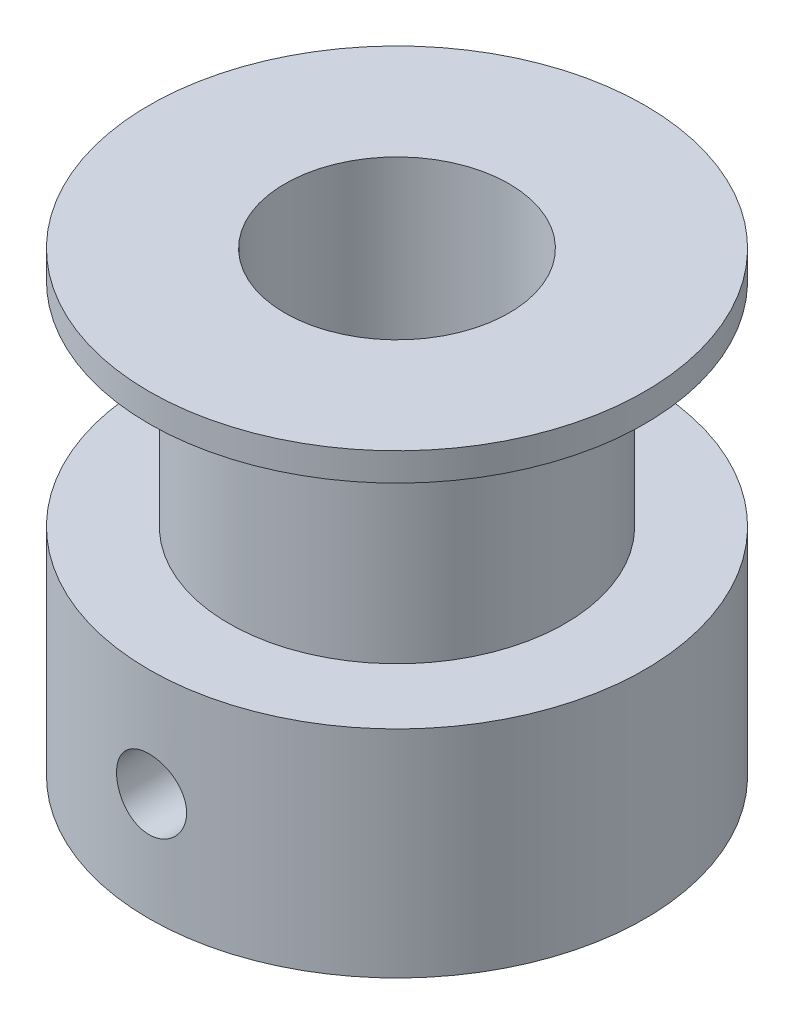
ISO-10303-21;
HEADER;
FILE_DESCRIPTION(('STEP AP214'),'2;1');
FILE_NAME('part.step','',(''),(''),'','','');
FILE_SCHEMA(('AUTOMOTIVE_DESIGN { 1 0 10303 214 1 1 1 1 }'));
ENDSEC;
DATA;
#1=APPLICATION_CONTEXT('core data for automotive mechanical design processes');
#2=APPLICATION_PROTOCOL_DEFINITION('international standard','automotive_design',2000,#1);
#3=PRODUCT_CONTEXT('',#1,'mechanical');
#4=PRODUCT('Part','Part','',(#3));
#5=PRODUCT_RELATED_PRODUCT_CATEGORY('part','',(#4));
#6=PRODUCT_DEFINITION_FORMATION('','',#4);
#7=PRODUCT_DEFINITION_CONTEXT('part definition',#1,'design');
#8=PRODUCT_DEFINITION('design','',#6,#7);
#9=PRODUCT_DEFINITION_SHAPE('','',#8);
#10=(LENGTH_UNIT() NAMED_UNIT(*) SI_UNIT(.MILLI.,.METRE.));
#11=(NAMED_UNIT(*) PLANE_ANGLE_UNIT() SI_UNIT($,.RADIAN.));
#12=(NAMED_UNIT(*) SI_UNIT($,.STERADIAN.) SOLID_ANGLE_UNIT());
#13=UNCERTAINTY_MEASURE_WITH_UNIT(LENGTH_MEASURE(1.E-05),#10,'distance_accuracy_value','');
#14=(GEOMETRIC_REPRESENTATION_CONTEXT(3) GLOBAL_UNCERTAINTY_ASSIGNED_CONTEXT((#13)) GLOBAL_UNIT_ASSIGNED_CONTEXT((#10,
#11,#12)) REPRESENTATION_CONTEXT('',''));
#15=CARTESIAN_POINT('',(0.,0.,0.));
#16=DIRECTION('',(0.,0.,1.));
#17=DIRECTION('',(1.,0.,0.));
#18=AXIS2_PLACEMENT_3D('',#15,#16,#17);
#19=CARTESIAN_POINT('',(0.,7.7,0.));
#20=DIRECTION('',(0.,1.,0.));
#21=DIRECTION('',(0.,0.,1.));
#22=AXIS2_PLACEMENT_3D('',#19,#20,#21);
#23=PLANE('',#22);
#24=CARTESIAN_POINT('',(0.,7.7,0.));
#25=DIRECTION('',(0.,1.,0.));
#26=DIRECTION('',(0.,0.,1.));
#27=AXIS2_PLACEMENT_3D('',#24,#25,#26);
#28=CIRCLE('',#27,8.85);
#29=CARTESIAN_POINT('',(0.,7.7,8.85));
#30=VERTEX_POINT('',#29);
#31=EDGE_CURVE('E12',#30,#30,#28,.T.);
#32=ORIENTED_EDGE('',*,*,#31,.T.);
#33=EDGE_LOOP('',(#32));
#34=FACE_BOUND('',#33,.T.);
#35=CARTESIAN_POINT('',(0.,7.7,0.));
#36=DIRECTION('',(0.,1.,0.));
#37=DIRECTION('',(0.,0.,1.));
#38=AXIS2_PLACEMENT_3D('',#35,#36,#37);
#39=CIRCLE('',#38,6.);
#40=CARTESIAN_POINT('',(0.,7.7,-6.));
#41=VERTEX_POINT('',#40);
#42=EDGE_CURVE('E59',#41,#41,#39,.T.);
#43=ORIENTED_EDGE('',*,*,#42,.F.);
#44=EDGE_LOOP('',(#43));
#45=FACE_BOUND('',#44,.T.);
#46=ADVANCED_FACE('F46',(#34,#45),#23,.T.);
#47=CARTESIAN_POINT('',(0.,7.7,0.));
#48=DIRECTION('',(0.,-1.,0.));
#49=DIRECTION('',(0.,0.,-1.));
#50=AXIS2_PLACEMENT_3D('',#47,#48,#49);
#51=CYLINDRICAL_SURFACE('',#50,8.85);
#52=CARTESIAN_POINT('',(-8.76127844552381,3.85,-1.25000000000002));
#53=CARTESIAN_POINT('',(-8.76127955833945,3.91983629256289,-1.24999708201939));
#54=CARTESIAN_POINT('',(-8.76212247343734,3.98971427935337,-1.24412769535317));
#55=CARTESIAN_POINT('',(-8.76540114993128,4.12751988072338,-1.22080955947898));
#56=CARTESIAN_POINT('',(-8.76783850599689,4.19544547155025,-1.20334921739481));
#57=CARTESIAN_POINT('',(-8.77402461798429,4.32733144869984,-1.15737909064777));
#58=CARTESIAN_POINT('',(-8.77777241048102,4.39129470754815,-1.12887742184564));
#59=CARTESIAN_POINT('',(-8.78615596433031,4.51352061150257,-1.06165220515114));
#60=CARTESIAN_POINT('',(-8.79079159250454,4.57178410961404,-1.02293019001592));
#61=CARTESIAN_POINT('',(-8.80046537837758,4.68138104602949,-0.936069093169977));
#62=CARTESIAN_POINT('',(-8.80550590770879,4.73266807354044,-0.8878717097803));
#63=CARTESIAN_POINT('',(-8.81540033266231,4.82645449615084,-0.783553810814694));
#64=CARTESIAN_POINT('',(-8.82025421838233,4.86895342552507,-0.727432875595245));
#65=CARTESIAN_POINT('',(-8.82925309298364,4.94412688567266,-0.608565508816701));
#66=CARTESIAN_POINT('',(-8.8333949838143,4.97675892816766,-0.545791952535329));
#67=CARTESIAN_POINT('',(-8.84047699071294,5.0309998483366,-0.415586968350984));
#68=CARTESIAN_POINT('',(-8.84341716324546,5.05260924393786,-0.34815575946884));
#69=CARTESIAN_POINT('',(-8.84774773304751,5.08405145650724,-0.211026547555804));
#70=CARTESIAN_POINT('',(-8.84914833092397,5.09396181936996,-0.141346652267816));
#71=CARTESIAN_POINT('',(-8.85027685753542,5.10196526324904,-0.00129975776516401));
#72=CARTESIAN_POINT('',(-8.85000486919982,5.10005893015542,0.0690672072108078));
#73=CARTESIAN_POINT('',(-8.84782705700059,5.08454464300186,0.207962261898438));
#74=CARTESIAN_POINT('',(-8.84593288036171,5.07102010490143,0.276499877460448));
#75=CARTESIAN_POINT('',(-8.84073651907011,5.03278405602722,0.410322920588073));
#76=CARTESIAN_POINT('',(-8.83743430158142,5.00807228436269,0.475608272270179));
#77=CARTESIAN_POINT('',(-8.82977283290082,4.94807662795789,0.601328189328235));
#78=CARTESIAN_POINT('',(-8.82541004388626,4.91275726389124,0.661745599009044));
#79=CARTESIAN_POINT('',(-8.81611436769792,4.83257487594348,0.775827507942207));
#80=CARTESIAN_POINT('',(-8.81118144720716,4.78771129419446,0.829491612165969));
#81=CARTESIAN_POINT('',(-8.80124557150607,4.68924834824854,0.92903470068311));
#82=CARTESIAN_POINT('',(-8.79624238072274,4.6355762003181,0.97484169729169));
#83=CARTESIAN_POINT('',(-8.78677200649964,4.5212679702468,1.05680912474714));
#84=CARTESIAN_POINT('',(-8.78230482569179,4.46063185391421,1.09296950822812));
#85=CARTESIAN_POINT('',(-8.77441239227346,4.33404593724077,1.15462488023047));
#86=CARTESIAN_POINT('',(-8.77098780359819,4.26809278461357,1.18011307643547));
#87=CARTESIAN_POINT('',(-8.76558046892521,4.13278293054173,1.21963133328681));
#88=CARTESIAN_POINT('',(-8.7635976333465,4.06342644084381,1.23366210582825));
#89=CARTESIAN_POINT('',(-8.76131509462908,3.92391743164996,1.24976976627735));
#90=CARTESIAN_POINT('',(-8.7610010621843,3.85377688884366,1.2519484271046));
#91=CARTESIAN_POINT('',(-8.76205369837487,3.71413173947837,1.24455950789984));
#92=CARTESIAN_POINT('',(-8.76342032095584,3.64462711554609,1.23499224973701));
#93=CARTESIAN_POINT('',(-8.76766715414962,3.50853824980679,1.20446916051189));
#94=CARTESIAN_POINT('',(-8.77054069443162,3.44194252801921,1.183563504715));
#95=CARTESIAN_POINT('',(-8.77747212514519,3.31320091658317,1.13100904540532));
#96=CARTESIAN_POINT('',(-8.78153006790803,3.25105522370454,1.09935976718954));
#97=CARTESIAN_POINT('',(-8.79040704938085,3.13251996690258,1.02596983980517));
#98=CARTESIAN_POINT('',(-8.79523100587522,3.07617176438167,0.98416299094421));
#99=CARTESIAN_POINT('',(-8.80508144112995,2.97125502092087,0.891737264962247));
#100=CARTESIAN_POINT('',(-8.81010792999751,2.92268686884142,0.841117947642463));
#101=CARTESIAN_POINT('',(-8.8198415792009,2.83434635877496,0.732057305954626));
#102=CARTESIAN_POINT('',(-8.82454612241681,2.79464123765306,0.673561251208003));
#103=CARTESIAN_POINT('',(-8.83306572575993,2.72562112238945,0.550670679829675));
#104=CARTESIAN_POINT('',(-8.83688080792471,2.6963058708156,0.486276309391627));
#105=CARTESIAN_POINT('',(-8.84318011476376,2.64900641894674,0.353631926318678));
#106=CARTESIAN_POINT('',(-8.84566874384817,2.63098468371386,0.285395516143358));
#107=CARTESIAN_POINT('',(-8.84905316166264,2.60666210993928,0.146827443991046));
#108=CARTESIAN_POINT('',(-8.84994904317226,2.60036058867938,0.076495904300664));
#109=CARTESIAN_POINT('',(-8.85004627804799,2.59967253564334,-0.0636122523454483));
#110=CARTESIAN_POINT('',(-8.84926230377789,2.60518283604321,-0.133388374619712));
#111=CARTESIAN_POINT('',(-8.84611733649831,2.62774184826329,-0.271011658388236));
#112=CARTESIAN_POINT('',(-8.84375634693595,2.64479053486225,-0.338858824098578));
#113=CARTESIAN_POINT('',(-8.83772137393164,2.6899072861997,-0.470675365074374));
#114=CARTESIAN_POINT('',(-8.83404814590582,2.71796901197764,-0.534646946667156));
#115=CARTESIAN_POINT('',(-8.82579336006288,2.78430443228636,-0.656989737158081));
#116=CARTESIAN_POINT('',(-8.8212117795589,2.82257838188407,-0.715360806124776));
#117=CARTESIAN_POINT('',(-8.81160272990891,2.90862818864169,-0.825370438534391));
#118=CARTESIAN_POINT('',(-8.80657186722225,2.95648047372549,-0.876948928289745));
#119=CARTESIAN_POINT('',(-8.79665715494533,3.06016810612595,-0.971382209874208));
#120=CARTESIAN_POINT('',(-8.79177334022663,3.11600532925321,-1.01423494611155));
#121=CARTESIAN_POINT('',(-8.78267983978148,3.23440042453076,-1.09018789773071));
#122=CARTESIAN_POINT('',(-8.77847360982668,3.29699018863463,-1.12323879986212));
#123=CARTESIAN_POINT('',(-8.77125197907736,3.42686011114792,-1.17831106476572));
#124=CARTESIAN_POINT('',(-8.76823532108644,3.49413522886783,-1.20034407840902));
#125=CARTESIAN_POINT('',(-8.76444461826387,3.60977522915171,-1.22765227176474));
#126=CARTESIAN_POINT('',(-8.76326345506154,3.65741987506185,-1.2360201377838));
#127=CARTESIAN_POINT('',(-8.76167998787418,3.7533696972197,-1.24719498147199));
#128=CARTESIAN_POINT('',(-8.76127767548057,3.80167486633063,-1.25000201917657));
#129=CARTESIAN_POINT('',(-8.76127844552381,3.85,-1.25000000000002));
#130=B_SPLINE_CURVE_WITH_KNOTS('',3,(#52,#53,#54,#55,#56,#57,#58,#59,#60,#61,#62,#63,#64,#65,
#66,#67,#68,#69,#70,#71,#72,#73,#74,#75,#76,#77,#78,#79,#80,#81,#82,#83,#84,#85,#86,#87,#88,#89,
#90,#91,#92,#93,#94,#95,#96,#97,#98,#99,#100,#101,#102,#103,#104,#105,#106,#107,#108,#109,#110,
#111,#112,#113,#114,#115,#116,#117,#118,#119,#120,#121,#122,#123,#124,#125,#126,#127,#128,#129),
.UNSPECIFIED.,.T.,.F.,(4,2,2,2,2,2,2,2,2,2,2,2,2,2,2,2,2,2,2,2,2,2,2,2,2,2,2,2,2,2,2,2,2,2,2,2,
2,2,4),(0.,0.209332280228205,0.41887424350023,0.628262475567086,0.837619323263729,
1.04830710403637,1.25900604734729,1.47059977743544,1.6821835643335,1.89235687022572,
2.1025197554847,2.3111862133078,2.51985753756676,2.72923473046087,2.93862416500036,
3.14983997735836,3.36105682678938,3.57240790165164,3.78374584343501,3.99326614850467,
4.20278071229308,4.41137559755892,4.61997970071267,4.82998162923051,5.03999405073688,
5.25154926862722,5.46309924439968,5.67394233441947,5.88477314216119,6.09377000087417,
6.30276640275181,6.51164268506203,6.72052418488635,6.93114408462367,7.14181354442582,
7.35352557529174,7.5650132552425,7.7098680186856,7.85472121824844),.UNSPECIFIED.);
#131=CARTESIAN_POINT('',(-8.76127844552381,3.85,-1.25000000000002));
#132=VERTEX_POINT('',#131);
#133=EDGE_CURVE('E103',#132,#132,#130,.T.);
#134=ORIENTED_EDGE('',*,*,#133,.T.);
#135=EDGE_LOOP('',(#134));
#136=FACE_BOUND('',#135,.T.);
#137=CARTESIAN_POINT('',(-1.24999999999999,3.85,8.76127844552381));
#138=CARTESIAN_POINT('',(-1.24999708201936,3.91983629256289,8.76127955833946));
#139=CARTESIAN_POINT('',(-1.24412769535314,3.98971427935337,8.76212247343735));
#140=CARTESIAN_POINT('',(-1.22080955947895,4.12751988072338,8.76540114993128));
#141=CARTESIAN_POINT('',(-1.20334921739478,4.19544547155025,8.7678385059969));
#142=CARTESIAN_POINT('',(-1.15737909064773,4.32733144869984,8.7740246179843));
#143=CARTESIAN_POINT('',(-1.12887742184561,4.39129470754815,8.77777241048102));
#144=CARTESIAN_POINT('',(-1.06165220515111,4.51352061150257,8.78615596433031));
#145=CARTESIAN_POINT('',(-1.02293019001589,4.57178410961404,8.79079159250454));
#146=CARTESIAN_POINT('',(-0.936069093169947,4.68138104602949,8.80046537837758));
#147=CARTESIAN_POINT('',(-0.887871709780269,4.73266807354044,8.8055059077088));
#148=CARTESIAN_POINT('',(-0.783553810814663,4.82645449615084,8.81540033266231));
#149=CARTESIAN_POINT('',(-0.727432875595214,4.86895342552507,8.82025421838234));
#150=CARTESIAN_POINT('',(-0.60856550881667,4.94412688567266,8.82925309298364));
#151=CARTESIAN_POINT('',(-0.545791952535298,4.97675892816766,8.8333949838143));
#152=CARTESIAN_POINT('',(-0.415586968350953,5.0309998483366,8.84047699071294));
#153=CARTESIAN_POINT('',(-0.348155759468809,5.05260924393786,8.84341716324546));
#154=CARTESIAN_POINT('',(-0.211026547555773,5.08405145650724,8.84774773304751));
#155=CARTESIAN_POINT('',(-0.141346652267786,5.09396181936996,8.84914833092397));
#156=CARTESIAN_POINT('',(-0.00129975776513321,5.10196526324904,8.85027685753542));
#157=CARTESIAN_POINT('',(0.0690672072108386,5.10005893015542,8.85000486919982));
#158=CARTESIAN_POINT('',(0.207962261898469,5.08454464300186,8.84782705700059));
#159=CARTESIAN_POINT('',(0.276499877460479,5.07102010490143,8.84593288036171));
#160=CARTESIAN_POINT('',(0.410322920588104,5.03278405602722,8.84073651907011));
#161=CARTESIAN_POINT('',(0.47560827227021,5.00807228436269,8.83743430158142));
#162=CARTESIAN_POINT('',(0.601328189328266,4.94807662795789,8.82977283290082));
#163=CARTESIAN_POINT('',(0.661745599009075,4.91275726389124,8.82541004388626));
#164=CARTESIAN_POINT('',(0.775827507942237,4.83257487594348,8.81611436769792));
#165=CARTESIAN_POINT('',(0.829491612166,4.78771129419446,8.81118144720716));
#166=CARTESIAN_POINT('',(0.929034700683141,4.68924834824854,8.80124557150607));
#167=CARTESIAN_POINT('',(0.974841697291721,4.6355762003181,8.79624238072274));
#168=CARTESIAN_POINT('',(1.05680912474717,4.5212679702468,8.78677200649963));
#169=CARTESIAN_POINT('',(1.09296950822815,4.46063185391421,8.78230482569179));
#170=CARTESIAN_POINT('',(1.1546248802305,4.33404593724077,8.77441239227345));
#171=CARTESIAN_POINT('',(1.1801130764355,4.26809278461357,8.77098780359818));
#172=CARTESIAN_POINT('',(1.21963133328684,4.13278293054173,8.7655804689252));
#173=CARTESIAN_POINT('',(1.23366210582828,4.06342644084381,8.7635976333465));
#174=CARTESIAN_POINT('',(1.24976976627738,3.92391743164996,8.76131509462908));
#175=CARTESIAN_POINT('',(1.25194842710463,3.85377688884366,8.76100106218429));
#176=CARTESIAN_POINT('',(1.24455950789987,3.71413173947837,8.76205369837486));
#177=CARTESIAN_POINT('',(1.23499224973704,3.64462711554609,8.76342032095583));
#178=CARTESIAN_POINT('',(1.20446916051192,3.50853824980679,8.76766715414961));
#179=CARTESIAN_POINT('',(1.18356350471503,3.44194252801921,8.77054069443162));
#180=CARTESIAN_POINT('',(1.13100904540535,3.31320091658317,8.77747212514519));
#181=CARTESIAN_POINT('',(1.09935976718957,3.25105522370454,8.78153006790803));
#182=CARTESIAN_POINT('',(1.0259698398052,3.13251996690258,8.79040704938084));
#183=CARTESIAN_POINT('',(0.984162990944241,3.07617176438167,8.79523100587522));
#184=CARTESIAN_POINT('',(0.891737264962278,2.97125502092087,8.80508144112994));
#185=CARTESIAN_POINT('',(0.841117947642493,2.92268686884142,8.8101079299975));
#186=CARTESIAN_POINT('',(0.732057305954657,2.83434635877496,8.81984157920089));
#187=CARTESIAN_POINT('',(0.673561251208034,2.79464123765306,8.82454612241681));
#188=CARTESIAN_POINT('',(0.550670679829706,2.72562112238945,8.83306572575993));
#189=CARTESIAN_POINT('',(0.486276309391658,2.6963058708156,8.83688080792471));
#190=CARTESIAN_POINT('',(0.353631926318709,2.64900641894674,8.84318011476376));
#191=CARTESIAN_POINT('',(0.285395516143389,2.63098468371386,8.84566874384817));
#192=CARTESIAN_POINT('',(0.146827443991076,2.60666210993928,8.84905316166264));
#193=CARTESIAN_POINT('',(0.0764959043006948,2.60036058867938,8.84994904317226));
#194=CARTESIAN_POINT('',(-0.0636122523454176,2.59967253564334,8.85004627804799));
#195=CARTESIAN_POINT('',(-0.133388374619681,2.60518283604321,8.84926230377789));
#196=CARTESIAN_POINT('',(-0.271011658388205,2.62774184826329,8.84611733649831));
#197=CARTESIAN_POINT('',(-0.338858824098547,2.64479053486225,8.84375634693595));
#198=CARTESIAN_POINT('',(-0.470675365074343,2.6899072861997,8.83772137393164));
#199=CARTESIAN_POINT('',(-0.534646946667125,2.71796901197764,8.83404814590583));
#200=CARTESIAN_POINT('',(-0.65698973715805,2.78430443228636,8.82579336006288));
#201=CARTESIAN_POINT('',(-0.715360806124745,2.82257838188407,8.82121177955891));
#202=CARTESIAN_POINT('',(-0.825370438534361,2.90862818864169,8.81160272990891));
#203=CARTESIAN_POINT('',(-0.876948928289715,2.95648047372549,8.80657186722225));
#204=CARTESIAN_POINT('',(-0.971382209874177,3.06016810612595,8.79665715494533));
#205=CARTESIAN_POINT('',(-1.01423494611152,3.11600532925321,8.79177334022663));
#206=CARTESIAN_POINT('',(-1.09018789773068,3.23440042453076,8.78267983978149));
#207=CARTESIAN_POINT('',(-1.12323879986209,3.29699018863463,8.77847360982668));
#208=CARTESIAN_POINT('',(-1.17831106476569,3.42686011114792,8.77125197907737));
#209=CARTESIAN_POINT('',(-1.20034407840899,3.49413522886783,8.76823532108645));
#210=CARTESIAN_POINT('',(-1.2276522717647,3.60977522915171,8.76444461826387));
#211=CARTESIAN_POINT('',(-1.23602013778377,3.65741987506185,8.76326345506155));
#212=CARTESIAN_POINT('',(-1.24719498147196,3.7533696972197,8.76167998787419));
#213=CARTESIAN_POINT('',(-1.25000201917654,3.80167486633063,8.76127767548057));
#214=CARTESIAN_POINT('',(-1.24999999999999,3.85,8.76127844552381));
#215=B_SPLINE_CURVE_WITH_KNOTS('',3,(#137,#138,#139,#140,#141,#142,#143,#144,#145,#146,#147,
#148,#149,#150,#151,#152,#153,#154,#155,#156,#157,#158,#159,#160,#161,#162,#163,#164,#165,#166,
#167,#168,#169,#170,#171,#172,#173,#174,#175,#176,#177,#178,#179,#180,#181,#182,#183,#184,#185,
#186,#187,#188,#189,#190,#191,#192,#193,#194,#195,#196,#197,#198,#199,#200,#201,#202,#203,#204,
#205,#206,#207,#208,#209,#210,#211,#212,#213,#214),.UNSPECIFIED.,.T.,.F.,(4,2,2,2,2,2,2,2,2,2,2,
2,2,2,2,2,2,2,2,2,2,2,2,2,2,2,2,2,2,2,2,2,2,2,2,2,2,2,4),(0.,0.209332280228205,0.41887424350023,
0.628262475567086,0.837619323263729,1.04830710403637,1.25900604734729,1.47059977743544,
1.6821835643335,1.89235687022572,2.1025197554847,2.3111862133078,2.51985753756676,
2.72923473046087,2.93862416500036,3.14983997735836,3.36105682678938,3.57240790165164,
3.78374584343501,3.99326614850467,4.20278071229308,4.41137559755892,4.61997970071267,
4.82998162923051,5.03999405073688,5.25154926862723,5.46309924439968,5.67394233441947,
5.88477314216119,6.09377000087417,6.30276640275182,6.51164268506203,6.72052418488635,
6.93114408462367,7.14181354442582,7.35352557529174,7.5650132552425,7.7098680186856,
7.85472121824844),.UNSPECIFIED.);
#216=CARTESIAN_POINT('',(-1.24999999999999,3.85,8.76127844552381));
#217=VERTEX_POINT('',#216);
#218=EDGE_CURVE('E83',#217,#217,#215,.T.);
#219=ORIENTED_EDGE('',*,*,#218,.T.);
#220=EDGE_LOOP('',(#219));
#221=FACE_BOUND('',#220,.T.);
#222=ORIENTED_EDGE('',*,*,#31,.F.);
#223=EDGE_LOOP('',(#222));
#224=FACE_BOUND('',#223,.T.);
#225=CARTESIAN_POINT('',(0.,0.,0.));
#226=DIRECTION('',(0.,1.,0.));
#227=DIRECTION('',(0.,0.,1.));
#228=AXIS2_PLACEMENT_3D('',#225,#226,#227);
#229=CIRCLE('',#228,8.85);
#230=CARTESIAN_POINT('',(0.,0.,8.85));
#231=VERTEX_POINT('',#230);
#232=EDGE_CURVE('E50',#231,#231,#229,.T.);
#233=ORIENTED_EDGE('',*,*,#232,.T.);
#234=EDGE_LOOP('',(#233));
#235=FACE_BOUND('',#234,.T.);
#236=ADVANCED_FACE('F48',(#136,#221,#224,#235),#51,.T.);
#237=CARTESIAN_POINT('',(0.,0.,0.));
#238=DIRECTION('',(0.,1.,0.));
#239=DIRECTION('',(0.,0.,1.));
#240=AXIS2_PLACEMENT_3D('',#237,#238,#239);
#241=PLANE('',#240);
#242=CARTESIAN_POINT('',(0.,0.,0.));
#243=DIRECTION('',(0.,1.,0.));
#244=DIRECTION('',(0.,0.,1.));
#245=AXIS2_PLACEMENT_3D('',#242,#243,#244);
#246=CIRCLE('',#245,4.);
#247=CARTESIAN_POINT('',(0.,0.,4.));
#248=VERTEX_POINT('',#247);
#249=EDGE_CURVE('E68',#248,#248,#246,.T.);
#250=ORIENTED_EDGE('',*,*,#249,.T.);
#251=EDGE_LOOP('',(#250));
#252=FACE_BOUND('',#251,.T.);
#253=ORIENTED_EDGE('',*,*,#232,.F.);
#254=EDGE_LOOP('',(#253));
#255=FACE_BOUND('',#254,.T.);
#256=ADVANCED_FACE('F146',(#252,#255),#241,.F.);
#257=CARTESIAN_POINT('',(0.,15.3,0.));
#258=DIRECTION('',(0.,-1.,0.));
#259=DIRECTION('',(0.,0.,-1.));
#260=AXIS2_PLACEMENT_3D('',#257,#258,#259);
#261=CYLINDRICAL_SURFACE('',#260,6.);
#262=CARTESIAN_POINT('',(0.,15.3,0.));
#263=DIRECTION('',(0.,1.,0.));
#264=DIRECTION('',(0.,0.,1.));
#265=AXIS2_PLACEMENT_3D('',#262,#263,#264);
#266=CIRCLE('',#265,6.);
#267=CARTESIAN_POINT('',(0.,15.3,-6.));
#268=VERTEX_POINT('',#267);
#269=EDGE_CURVE('E57',#268,#268,#266,.T.);
#270=CARTESIAN_POINT('',(0.,15.3,-6.));
#271=CARTESIAN_POINT('',(0.,15.2208333333333,-6.));
#272=CARTESIAN_POINT('',(0.,15.1416666666667,-6.));
#273=CARTESIAN_POINT('',(0.,14.9833333333333,-6.));
#274=CARTESIAN_POINT('',(0.,14.9041666666667,-6.));
#275=CARTESIAN_POINT('',(0.,14.7458333333333,-6.));
#276=CARTESIAN_POINT('',(0.,14.6666666666667,-6.));
#277=CARTESIAN_POINT('',(0.,14.5083333333333,-6.));
#278=CARTESIAN_POINT('',(0.,14.4291666666667,-6.));
#279=CARTESIAN_POINT('',(0.,14.2708333333333,-6.));
#280=CARTESIAN_POINT('',(0.,14.1916666666667,-6.));
#281=CARTESIAN_POINT('',(0.,14.0333333333333,-6.));
#282=CARTESIAN_POINT('',(0.,13.9541666666667,-6.));
#283=CARTESIAN_POINT('',(0.,13.7958333333333,-6.));
#284=CARTESIAN_POINT('',(0.,13.7166666666667,-6.));
#285=CARTESIAN_POINT('',(0.,13.5583333333333,-6.));
#286=CARTESIAN_POINT('',(0.,13.4791666666667,-6.));
#287=CARTESIAN_POINT('',(0.,13.3208333333333,-6.));
#288=CARTESIAN_POINT('',(0.,13.2416666666667,-6.));
#289=CARTESIAN_POINT('',(0.,13.0833333333333,-6.));
#290=CARTESIAN_POINT('',(0.,13.0041666666667,-6.));
#291=CARTESIAN_POINT('',(0.,12.8458333333333,-6.));
#292=CARTESIAN_POINT('',(0.,12.7666666666667,-6.));
#293=CARTESIAN_POINT('',(0.,12.6083333333333,-6.));
#294=CARTESIAN_POINT('',(0.,12.5291666666667,-6.));
#295=CARTESIAN_POINT('',(0.,12.3708333333333,-6.));
#296=CARTESIAN_POINT('',(0.,12.2916666666667,-6.));
#297=CARTESIAN_POINT('',(0.,12.1333333333333,-6.));
#298=CARTESIAN_POINT('',(0.,12.0541666666667,-6.));
#299=CARTESIAN_POINT('',(0.,11.8958333333333,-6.));
#300=CARTESIAN_POINT('',(0.,11.8166666666667,-6.));
#301=CARTESIAN_POINT('',(0.,11.6583333333333,-6.));
#302=CARTESIAN_POINT('',(0.,11.5791666666667,-6.));
#303=CARTESIAN_POINT('',(0.,11.4208333333333,-6.));
#304=CARTESIAN_POINT('',(0.,11.3416666666667,-6.));
#305=CARTESIAN_POINT('',(0.,11.1833333333333,-6.));
#306=CARTESIAN_POINT('',(0.,11.1041666666667,-6.));
#307=CARTESIAN_POINT('',(0.,10.9458333333333,-6.));
#308=CARTESIAN_POINT('',(0.,10.8666666666667,-6.));
#309=CARTESIAN_POINT('',(0.,10.7083333333333,-6.));
#310=CARTESIAN_POINT('',(0.,10.6291666666667,-6.));
#311=CARTESIAN_POINT('',(0.,10.4708333333333,-6.));
#312=CARTESIAN_POINT('',(0.,10.3916666666667,-6.));
#313=CARTESIAN_POINT('',(0.,10.2333333333333,-6.));
#314=CARTESIAN_POINT('',(0.,10.1541666666667,-6.));
#315=CARTESIAN_POINT('',(0.,9.99583333333333,-6.));
#316=CARTESIAN_POINT('',(0.,9.91666666666667,-6.));
#317=CARTESIAN_POINT('',(0.,9.75833333333333,-6.));
#318=CARTESIAN_POINT('',(0.,9.67916666666667,-6.));
#319=CARTESIAN_POINT('',(0.,9.52083333333333,-6.));
#320=CARTESIAN_POINT('',(0.,9.44166666666667,-6.));
#321=CARTESIAN_POINT('',(0.,9.28333333333333,-6.));
#322=CARTESIAN_POINT('',(0.,9.20416666666667,-6.));
#323=CARTESIAN_POINT('',(0.,9.04583333333333,-6.));
#324=CARTESIAN_POINT('',(0.,8.96666666666667,-6.));
#325=CARTESIAN_POINT('',(0.,8.80833333333333,-6.));
#326=CARTESIAN_POINT('',(0.,8.72916666666667,-6.));
#327=CARTESIAN_POINT('',(0.,8.57083333333333,-6.));
#328=CARTESIAN_POINT('',(0.,8.49166666666667,-6.));
#329=CARTESIAN_POINT('',(0.,8.33333333333333,-6.));
#330=CARTESIAN_POINT('',(0.,8.25416666666666,-6.));
#331=CARTESIAN_POINT('',(0.,8.09583333333333,-6.));
#332=CARTESIAN_POINT('',(0.,8.01666666666667,-6.));
#333=CARTESIAN_POINT('',(0.,7.85833333333333,-6.));
#334=CARTESIAN_POINT('',(0.,7.77916666666667,-6.));
#335=CARTESIAN_POINT('',(0.,7.7,-6.));
#336=B_SPLINE_CURVE_WITH_KNOTS('',3,(#270,#271,#272,#273,#274,#275,#276,#277,#278,#279,#280,
#281,#282,#283,#284,#285,#286,#287,#288,#289,#290,#291,#292,#293,#294,#295,#296,#297,#298,#299,
#300,#301,#302,#303,#304,#305,#306,#307,#308,#309,#310,#311,#312,#313,#314,#315,#316,#317,#318,
#319,#320,#321,#322,#323,#324,#325,#326,#327,#328,#329,#330,#331,#332,#333,#334,#335),
.UNSPECIFIED.,.F.,.F.,(4,2,2,2,2,2,2,2,2,2,2,2,2,2,2,2,2,2,2,2,2,2,2,2,2,2,2,2,2,2,2,2,4),(0.,
0.237500000000002,0.475000000000001,0.712500000000001,0.950000000000001,1.1875,1.425,1.6625,1.9,
2.1375,2.375,2.6125,2.85,3.0875,3.325,3.5625,3.8,4.0375,4.275,4.5125,4.75,4.9875,5.225,5.4625,
5.7,5.9375,6.175,6.4125,6.65,6.8875,7.125,7.3625,7.6),.UNSPECIFIED.);
#337=EDGE_CURVE('BSEAM140',#268,#41,#336,.T.);
#338=ORIENTED_EDGE('',*,*,#269,.F.);
#339=ORIENTED_EDGE('',*,*,#42,.T.);
#340=ORIENTED_EDGE('',*,*,#337,.T.);
#341=ORIENTED_EDGE('',*,*,#337,.F.);
#342=EDGE_LOOP('',(#338,#340,#339,#341));
#343=FACE_BOUND('',#342,.T.);
#344=ADVANCED_FACE('F140',(#343),#261,.T.);
#345=CARTESIAN_POINT('',(0.,15.3,0.));
#346=DIRECTION('',(0.,1.,0.));
#347=DIRECTION('',(0.,0.,1.));
#348=AXIS2_PLACEMENT_3D('',#345,#346,#347);
#349=PLANE('',#348);
#350=CARTESIAN_POINT('',(0.,15.3,0.));
#351=DIRECTION('',(0.,1.,0.));
#352=DIRECTION('',(0.,0.,1.));
#353=AXIS2_PLACEMENT_3D('',#350,#351,#352);
#354=CIRCLE('',#353,8.85);
#355=CARTESIAN_POINT('',(0.,15.3,8.85));
#356=VERTEX_POINT('',#355);
#357=EDGE_CURVE('E65',#356,#356,#354,.T.);
#358=ORIENTED_EDGE('',*,*,#357,.F.);
#359=EDGE_LOOP('',(#358));
#360=FACE_BOUND('',#359,.T.);
#361=ORIENTED_EDGE('',*,*,#269,.T.);
#362=EDGE_LOOP('',(#361));
#363=FACE_BOUND('',#362,.T.);
#364=ADVANCED_FACE('F134',(#360,#363),#349,.F.);
#365=CARTESIAN_POINT('',(0.,16.3,0.));
#366=DIRECTION('',(0.,-1.,0.));
#367=DIRECTION('',(0.,0.,-1.));
#368=AXIS2_PLACEMENT_3D('',#365,#366,#367);
#369=CYLINDRICAL_SURFACE('',#368,8.85);
#370=CARTESIAN_POINT('',(0.,16.3,0.));
#371=DIRECTION('',(0.,1.,0.));
#372=DIRECTION('',(0.,0.,1.));
#373=AXIS2_PLACEMENT_3D('',#370,#371,#372);
#374=CIRCLE('',#373,8.85);
#375=CARTESIAN_POINT('',(0.,16.3,8.85));
#376=VERTEX_POINT('',#375);
#377=EDGE_CURVE('E62',#376,#376,#374,.T.);
#378=ORIENTED_EDGE('',*,*,#377,.F.);
#379=EDGE_LOOP('',(#378));
#380=FACE_BOUND('',#379,.T.);
#381=ORIENTED_EDGE('',*,*,#357,.T.);
#382=EDGE_LOOP('',(#381));
#383=FACE_BOUND('',#382,.T.);
#384=ADVANCED_FACE('F129',(#380,#383),#369,.T.);
#385=CARTESIAN_POINT('',(0.,16.3,0.));
#386=DIRECTION('',(0.,1.,0.));
#387=DIRECTION('',(0.,0.,1.));
#388=AXIS2_PLACEMENT_3D('',#385,#386,#387);
#389=PLANE('',#388);
#390=CARTESIAN_POINT('',(0.,16.3,0.));
#391=DIRECTION('',(0.,1.,0.));
#392=DIRECTION('',(0.,0.,1.));
#393=AXIS2_PLACEMENT_3D('',#390,#391,#392);
#394=CIRCLE('',#393,4.);
#395=CARTESIAN_POINT('',(0.,16.3,4.));
#396=VERTEX_POINT('',#395);
#397=EDGE_CURVE('E71',#396,#396,#394,.T.);
#398=ORIENTED_EDGE('',*,*,#397,.F.);
#399=EDGE_LOOP('',(#398));
#400=FACE_BOUND('',#399,.T.);
#401=ORIENTED_EDGE('',*,*,#377,.T.);
#402=EDGE_LOOP('',(#401));
#403=FACE_BOUND('',#402,.T.);
#404=ADVANCED_FACE('F122',(#400,#403),#389,.T.);
#405=CARTESIAN_POINT('',(0.,0.,0.));
#406=DIRECTION('',(0.,1.,0.));
#407=DIRECTION('',(0.,0.,1.));
#408=AXIS2_PLACEMENT_3D('',#405,#406,#407);
#409=CYLINDRICAL_SURFACE('',#408,4.);
#410=CARTESIAN_POINT('',(-3.79967103839266,3.85,-1.25000000000001));
#411=CARTESIAN_POINT('',(-3.79967145961936,3.78165296389066,-1.24999953780048));
#412=CARTESIAN_POINT('',(-3.80153531505043,3.7133012312968,-1.24437538791495));
#413=CARTESIAN_POINT('',(-3.80875638998877,3.5786058391222,-1.22209175401327));
#414=CARTESIAN_POINT('',(-3.81411455353136,3.51226272726784,-1.20542928782516));
#415=CARTESIAN_POINT('',(-3.8276593883596,3.383555098068,-1.16169788223559));
#416=CARTESIAN_POINT('',(-3.83584105194317,3.32118376689432,-1.13464735736677));
#417=CARTESIAN_POINT('',(-3.85410406218688,3.20184730413599,-1.07096914173157));
#418=CARTESIAN_POINT('',(-3.8641857443584,3.14488313003988,-1.03433975905633));
#419=CARTESIAN_POINT('',(-3.8855012766862,3.03602113250652,-0.951196070622299));
#420=CARTESIAN_POINT('',(-3.8967612338478,2.98433639056402,-0.904409399720405));
#421=CARTESIAN_POINT('',(-3.91894245860335,2.88940398679082,-0.802862046455502));
#422=CARTESIAN_POINT('',(-3.92986367872627,2.84615750305516,-0.748100252518573));
#423=CARTESIAN_POINT('',(-3.95043553390078,2.76838893698876,-0.630625912493371));
#424=CARTESIAN_POINT('',(-3.9600518456278,2.73408629616855,-0.567761556520104));
#425=CARTESIAN_POINT('',(-3.97662551833019,2.67662395014446,-0.436804232853413));
#426=CARTESIAN_POINT('',(-3.98358350419919,2.65346162585042,-0.368712498487062));
#427=CARTESIAN_POINT('',(-3.99387175820862,2.61964887190294,-0.231464356966109));
#428=CARTESIAN_POINT('',(-3.99730738984143,2.60863425021216,-0.162405715468227));
#429=CARTESIAN_POINT('',(-4.00053595876015,2.59827565356248,-0.0233408139845329));
#430=CARTESIAN_POINT('',(-4.00032972410065,2.59892902564118,0.0466652269730704));
#431=CARTESIAN_POINT('',(-3.99637116132537,2.61164829158595,0.183074480354721));
#432=CARTESIAN_POINT('',(-3.99274150972157,2.62331938351303,0.249518634314029));
#433=CARTESIAN_POINT('',(-3.98249482560855,2.65709499004301,0.379453063347755));
#434=CARTESIAN_POINT('',(-3.97587759827134,2.67920018508656,0.44294314548118));
#435=CARTESIAN_POINT('',(-3.96023459729533,2.73347018907489,0.566078103154765));
#436=CARTESIAN_POINT('',(-3.95118033616957,2.76575480856304,0.625666405622815));
#437=CARTESIAN_POINT('',(-3.93161722953562,2.83937109970457,0.738702511152012));
#438=CARTESIAN_POINT('',(-3.92110801644585,2.88070505913784,0.79214875620882));
#439=CARTESIAN_POINT('',(-3.89923670734647,2.9732736348013,0.893737698453863));
#440=CARTESIAN_POINT('',(-3.88785731989084,3.02484906884121,0.94156654909416));
#441=CARTESIAN_POINT('',(-3.86590615440413,3.13539510182447,1.02798974259536));
#442=CARTESIAN_POINT('',(-3.85533447159847,3.19436657057501,1.06658299775339));
#443=CARTESIAN_POINT('',(-3.83610846648974,3.31891746885985,1.13380465019764));
#444=CARTESIAN_POINT('',(-3.82747690354324,3.3845634090424,1.1623168070268));
#445=CARTESIAN_POINT('',(-3.81337545338914,3.52005949189535,1.20778345948511));
#446=CARTESIAN_POINT('',(-3.80790443033294,3.58990811421049,1.22474210765791));
#447=CARTESIAN_POINT('',(-3.80099563391873,3.72881995256584,1.24601485185707));
#448=CARTESIAN_POINT('',(-3.79940466389697,3.79780199623211,1.25080954353709));
#449=CARTESIAN_POINT('',(-3.80001077463985,3.93558974149816,1.24896744498305));
#450=CARTESIAN_POINT('',(-3.8022072700839,4.00439546870047,1.24233242111454));
#451=CARTESIAN_POINT('',(-3.80998957482875,4.13780829665165,1.21824873513141));
#452=CARTESIAN_POINT('',(-3.81547554101732,4.20247927407399,1.20111831160536));
#453=CARTESIAN_POINT('',(-3.82911287331661,4.32802179199604,1.15690373661025));
#454=CARTESIAN_POINT('',(-3.83726467412388,4.38889271092119,1.12981796171153));
#455=CARTESIAN_POINT('',(-3.85560539653157,4.50703910977175,1.06557510655873));
#456=CARTESIAN_POINT('',(-3.86584603489734,4.56416141559277,1.02815147488555));
#457=CARTESIAN_POINT('',(-3.88710348972829,4.67149034636192,0.944606408679791));
#458=CARTESIAN_POINT('',(-3.89812050735703,4.72169516892533,0.898482714690763));
#459=CARTESIAN_POINT('',(-3.9202418756268,4.81591036591281,0.796572947753585));
#460=CARTESIAN_POINT('',(-3.9313309228568,4.85957778613986,0.740465649788501));
#461=CARTESIAN_POINT('',(-3.95189059843679,4.93689104332125,0.621451545651379));
#462=CARTESIAN_POINT('',(-3.96136130090946,4.97053733931103,0.558545051108604));
#463=CARTESIAN_POINT('',(-3.97756311928512,5.02653056247168,0.428105523331813));
#464=CARTESIAN_POINT('',(-3.984313995612,5.04895928784368,0.360610184283738));
#465=CARTESIAN_POINT('',(-3.99440242648576,5.0820725385897,0.222557254056372));
#466=CARTESIAN_POINT('',(-3.99774104914277,5.09276073908349,0.15200062834034));
#467=CARTESIAN_POINT('',(-4.00055803404462,5.10179100174962,0.0129849366488833));
#468=CARTESIAN_POINT('',(-4.0001912940739,5.10062845017075,-0.0554391919465373));
#469=CARTESIAN_POINT('',(-3.99600978081049,5.0871881889513,-0.191073221923262));
#470=CARTESIAN_POINT('',(-3.99219523232619,5.07491120400805,-0.258283202179582));
#471=CARTESIAN_POINT('',(-3.98159570844795,5.03990599077772,-0.388755118480804));
#472=CARTESIAN_POINT('',(-3.97484847960205,5.01731039215462,-0.452055918449494));
#473=CARTESIAN_POINT('',(-3.9590794558795,4.96242917279152,-0.573998425500103));
#474=CARTESIAN_POINT('',(-3.95005727091358,4.93014189002657,-0.632639331274493));
#475=CARTESIAN_POINT('',(-3.93029896883376,4.85552724165555,-0.745761694969699));
#476=CARTESIAN_POINT('',(-3.91951509750962,4.81289647753602,-0.800034607053122));
#477=CARTESIAN_POINT('',(-3.89758736547061,4.71934011055653,-0.900820791399329));
#478=CARTESIAN_POINT('',(-3.88644339784826,4.66841202586061,-0.947331733504169));
#479=CARTESIAN_POINT('',(-3.86461892577438,4.5576842801589,-1.03282865911253));
#480=CARTESIAN_POINT('',(-3.85396600863456,4.49764659688342,-1.07151427994712));
#481=CARTESIAN_POINT('',(-3.83480125279531,4.37160187973086,-1.13820470748522));
#482=CARTESIAN_POINT('',(-3.82628854861386,4.30559727354975,-1.16621383403546));
#483=CARTESIAN_POINT('',(-3.81306560440327,4.17527738268533,-1.20871180435793));
#484=CARTESIAN_POINT('',(-3.80809315043749,4.11129745254843,-1.22414939837874));
#485=CARTESIAN_POINT('',(-3.80139606482398,3.98154616790351,-1.244792458161));
#486=CARTESIAN_POINT('',(-3.79967063301598,3.9157752587985,-1.25000044480779));
#487=CARTESIAN_POINT('',(-3.79967103839266,3.85,-1.25000000000001));
#488=B_SPLINE_CURVE_WITH_KNOTS('',3,(#410,#411,#412,#413,#414,#415,#416,#417,#418,#419,#420,
#421,#422,#423,#424,#425,#426,#427,#428,#429,#430,#431,#432,#433,#434,#435,#436,#437,#438,#439,
#440,#441,#442,#443,#444,#445,#446,#447,#448,#449,#450,#451,#452,#453,#454,#455,#456,#457,#458,
#459,#460,#461,#462,#463,#464,#465,#466,#467,#468,#469,#470,#471,#472,#473,#474,#475,#476,#477,
#478,#479,#480,#481,#482,#483,#484,#485,#486,#487),.UNSPECIFIED.,.T.,.F.,(4,2,2,2,2,2,2,2,2,2,2,
2,2,2,2,2,2,2,2,2,2,2,2,2,2,2,2,2,2,2,2,2,2,2,2,2,2,2,4),(0.,0.204798137548489,
0.409651627059733,0.614143644118579,0.818671804924945,1.02957080550838,1.24049922941122,
1.45619821963732,1.67184647417921,1.88083722835533,2.08978046471773,2.29150982969749,
2.49325235190092,2.69746404608407,2.90172742713186,3.11450338937332,3.32730439853774,
3.54248470934452,3.75758763952751,3.96404933287933,4.17047912219087,4.37093972044361,
4.57143302253207,4.77767613309608,4.98397288011877,5.19881937811508,5.41365603317084,
5.62690239290995,5.84008198140582,6.04438802439521,6.24868074692303,6.45041846514756,
6.65219079911648,6.86080693105211,7.06948557772186,7.28507795501701,7.50058300803818,
7.69772354371382,7.89481549188774),.UNSPECIFIED.);
#489=CARTESIAN_POINT('',(-3.79967103839266,3.85,-1.25000000000001));
#490=VERTEX_POINT('',#489);
#491=EDGE_CURVE('E107',#490,#490,#488,.T.);
#492=ORIENTED_EDGE('',*,*,#491,.T.);
#493=EDGE_LOOP('',(#492));
#494=FACE_BOUND('',#493,.T.);
#495=CARTESIAN_POINT('',(0.,2.60000000000001,4.));
#496=CARTESIAN_POINT('',(0.0684391851745461,2.60000044658758,3.99999965877989));
#497=CARTESIAN_POINT('',(0.136883052502858,2.60563922694446,3.99822694984841));
#498=CARTESIAN_POINT('',(0.271769209588447,2.62798624153924,3.99132894088807));
#499=CARTESIAN_POINT('',(0.338211042725905,2.64469698136437,3.9862028819986));
#500=CARTESIAN_POINT('',(0.467128543650804,2.68856937119575,3.97315815697909));
#501=CARTESIAN_POINT('',(0.5296101769858,2.71571484465297,3.96524381499025));
#502=CARTESIAN_POINT('',(0.649134802346456,2.77961731767834,3.94743969161093));
#503=CARTESIAN_POINT('',(0.706176935444881,2.81637583178059,3.93754959899905));
#504=CARTESIAN_POINT('',(0.814965334952276,2.89965599201737,3.91650213740282));
#505=CARTESIAN_POINT('',(0.866520028156654,2.94642088506108,3.90531715926989));
#506=CARTESIAN_POINT('',(0.961197382036988,3.04786839241355,3.88310046374209));
#507=CARTESIAN_POINT('',(1.00431847289869,3.10255247749455,3.87206877523457));
#508=CARTESIAN_POINT('',(1.08194336483113,3.21994456380809,3.85111144698172));
#509=CARTESIAN_POINT('',(1.11620784150128,3.28281747752722,3.84121988301796));
#510=CARTESIAN_POINT('',(1.17359741076671,3.41379231498188,3.82407801799234));
#511=CARTESIAN_POINT('',(1.19672543771944,3.48189285579393,3.81682702128689));
#512=CARTESIAN_POINT('',(1.23048459930033,3.61922807745206,3.80607606984501));
#513=CARTESIAN_POINT('',(1.24147110007864,3.68836684363885,3.80246972929509));
#514=CARTESIAN_POINT('',(1.25174555036987,3.82759311891189,3.79910055140951));
#515=CARTESIAN_POINT('',(1.25103660995771,3.89768037082166,3.79933669227334));
#516=CARTESIAN_POINT('',(1.23821824732739,4.03387446026898,3.80353189075438));
#517=CARTESIAN_POINT('',(1.22656057869382,4.10002912586156,3.80734341745949));
#518=CARTESIAN_POINT('',(1.19290813355625,4.22939215653734,3.81802025652489));
#519=CARTESIAN_POINT('',(1.1709122584455,4.2926002077088,3.82488589343115));
#520=CARTESIAN_POINT('',(1.11688874681277,4.41535194443263,3.84101044014297));
#521=CARTESIAN_POINT('',(1.08471925662081,4.47482861069198,3.85030284660825));
#522=CARTESIAN_POINT('',(1.01136020737848,4.58768776787912,3.8702185658007));
#523=CARTESIAN_POINT('',(0.970168305215768,4.64106867025371,3.88084222394551));
#524=CARTESIAN_POINT('',(0.877716954182119,4.74277494341698,3.90281527800493));
#525=CARTESIAN_POINT('',(0.826084570592813,4.79075955777968,3.91417569605696));
#526=CARTESIAN_POINT('',(0.715364408095528,4.87747189357967,3.9359157075958));
#527=CARTESIAN_POINT('',(0.656276077349017,4.9161989292192,3.94629522838372));
#528=CARTESIAN_POINT('',(0.531664610465452,4.98352768860127,3.96501294890191));
#529=CARTESIAN_POINT('',(0.466094906919277,5.01204813546396,3.97333460648208));
#530=CARTESIAN_POINT('',(0.330767977782643,5.05755300085156,3.98687955828554));
#531=CARTESIAN_POINT('',(0.261012030724607,5.07454092223839,3.99210379325151));
#532=CARTESIAN_POINT('',(0.122185157290344,5.09591804257897,3.99871389395014));
#533=CARTESIAN_POINT('',(0.0531918487888425,5.10076854359352,4.00024022895439));
#534=CARTESIAN_POINT('',(-0.0846303057325837,5.09903377336266,3.99969799730981));
#535=CARTESIAN_POINT('',(-0.153459174306504,5.09245017267739,3.99762995581125));
#536=CARTESIAN_POINT('',(-0.28721933297585,5.0684044073936,3.99022363769772));
#537=CARTESIAN_POINT('',(-0.352204978420945,5.05121673238748,3.98496793110725));
#538=CARTESIAN_POINT('',(-0.478351928861362,5.00678564763331,3.97180121379252));
#539=CARTESIAN_POINT('',(-0.539512760449012,4.97954099597509,3.96388987514204));
#540=CARTESIAN_POINT('',(-0.657932406672227,4.9150267834512,3.94598542759568));
#541=CARTESIAN_POINT('',(-0.71505973978795,4.87752901250278,3.9359462681821));
#542=CARTESIAN_POINT('',(-0.82236585096009,4.79384678988298,3.91493410002887));
#543=CARTESIAN_POINT('',(-0.872542738043331,4.74765998225688,3.90396083845862));
#544=CARTESIAN_POINT('',(-0.96658746291965,4.64574110994631,3.88176994885248));
#545=CARTESIAN_POINT('',(-1.01012652339773,4.58970333625474,3.87055986714446));
#546=CARTESIAN_POINT('',(-1.08721250244908,4.47087338362926,3.84961947087602));
#547=CARTESIAN_POINT('',(-1.12075957972523,4.40808131199557,3.839889132814));
#548=CARTESIAN_POINT('',(-1.1767008348114,4.27765482711414,3.82311782360754));
#549=CARTESIAN_POINT('',(-1.19913819558885,4.2100403504953,3.81606646468027));
#550=CARTESIAN_POINT('',(-1.23222894320963,4.0717275066762,3.80551170941212));
#551=CARTESIAN_POINT('',(-1.24288681414609,4.00103032362869,3.80200696302675));
#552=CARTESIAN_POINT('',(-1.2517940615754,3.86199591244576,3.79908292712495));
#553=CARTESIAN_POINT('',(-1.25058279621956,3.79369654618707,3.79948604683077));
#554=CARTESIAN_POINT('',(-1.23708818129473,3.65832541508082,3.80390090472383));
#555=CARTESIAN_POINT('',(-1.22480534822558,3.591253593116,3.80791247457319));
#556=CARTESIAN_POINT('',(-1.18987729913377,3.46120596039822,3.81896814158112));
#557=CARTESIAN_POINT('',(-1.16738642405943,3.39818455890399,3.82596698183475));
#558=CARTESIAN_POINT('',(-1.11280227335063,3.27675958646865,3.84219704261348));
#559=CARTESIAN_POINT('',(-1.08070704444254,3.21835695792232,3.85142871716522));
#560=CARTESIAN_POINT('',(-1.00635675013474,3.10535402955944,3.8715348703158));
#561=CARTESIAN_POINT('',(-0.963753335241267,3.05099187049956,3.88245948922441));
#562=CARTESIAN_POINT('',(-0.870208996404842,2.95001367188821,3.90448998821726));
#563=CARTESIAN_POINT('',(-0.819265842344397,2.903399711009,3.91559591606795));
#564=CARTESIAN_POINT('',(-0.708486662823327,2.81771746163702,3.93717271952329));
#565=CARTESIAN_POINT('',(-0.648414574487375,2.77894526355004,3.94761101730634));
#566=CARTESIAN_POINT('',(-0.522279138013649,2.71210108486057,3.96626769296917));
#567=CARTESIAN_POINT('',(-0.456218157795445,2.68402489785818,3.97448694315832));
#568=CARTESIAN_POINT('',(-0.325747635373975,2.64140863239154,3.98720650733461));
#569=CARTESIAN_POINT('',(-0.261670337112544,2.62592513269467,3.99196240806139));
#570=CARTESIAN_POINT('',(-0.131729895440247,2.60522164003229,3.99835900340486));
#571=CARTESIAN_POINT('',(-0.0658671161396742,2.59999957019601,4.00000032839644));
#572=CARTESIAN_POINT('',(0.,2.60000000000001,4.));
#573=B_SPLINE_CURVE_WITH_KNOTS('',3,(#495,#496,#497,#498,#499,#500,#501,#502,#503,#504,#505,
#506,#507,#508,#509,#510,#511,#512,#513,#514,#515,#516,#517,#518,#519,#520,#521,#522,#523,#524,
#525,#526,#527,#528,#529,#530,#531,#532,#533,#534,#535,#536,#537,#538,#539,#540,#541,#542,#543,
#544,#545,#546,#547,#548,#549,#550,#551,#552,#553,#554,#555,#556,#557,#558,#559,#560,#561,#562,
#563,#564,#565,#566,#567,#568,#569,#570,#571,#572),.UNSPECIFIED.,.T.,.F.,(4,2,2,2,2,2,2,2,2,2,2,
2,2,2,2,2,2,2,2,2,2,2,2,2,2,2,2,2,2,2,2,2,2,2,2,2,2,2,4),(0.,0.205075449432509,
0.410197323349064,0.615002479202433,0.819839921558386,1.03037822195158,1.24095567431275,
1.45673771247493,1.67246286279526,1.88169150167209,2.09086450295137,2.29176917422168,
2.49269519979061,2.69655642720544,2.90047066010357,3.11366747279598,3.32688007413301,
3.54175460689768,3.75656384494552,3.96307568548235,4.1695573564936,4.37090626722869,
4.57228005034497,4.7785632473834,4.98490245709256,5.19941778713137,5.41392970983709,
5.62760115751028,5.84119123892427,6.0451220347605,6.24904331751081,6.44997913396668,
6.6509558433017,6.85979514006358,7.06869037373337,7.28440668126408,7.50003806666333,
7.69744636651537,7.89481470763043),.UNSPECIFIED.);
#574=CARTESIAN_POINT('',(0.,2.60000000000001,4.));
#575=VERTEX_POINT('',#574);
#576=EDGE_CURVE('E74',#575,#575,#573,.T.);
#577=ORIENTED_EDGE('',*,*,#576,.T.);
#578=EDGE_LOOP('',(#577));
#579=FACE_BOUND('',#578,.T.);
#580=ORIENTED_EDGE('',*,*,#249,.F.);
#581=EDGE_LOOP('',(#580));
#582=FACE_BOUND('',#581,.T.);
#583=ORIENTED_EDGE('',*,*,#397,.T.);
#584=EDGE_LOOP('',(#583));
#585=FACE_BOUND('',#584,.T.);
#586=ADVANCED_FACE('F88',(#494,#579,#582,#585),#409,.F.);
#587=CARTESIAN_POINT('',(0.,3.85,0.));
#588=DIRECTION('',(0.,0.,-1.));
#589=DIRECTION('',(-1.,0.,0.));
#590=AXIS2_PLACEMENT_3D('',#587,#588,#589);
#591=CYLINDRICAL_SURFACE('',#590,1.24999999999999);
#592=ORIENTED_EDGE('',*,*,#218,.F.);
#593=EDGE_LOOP('',(#592));
#594=FACE_BOUND('',#593,.T.);
#595=ORIENTED_EDGE('',*,*,#576,.F.);
#596=EDGE_LOOP('',(#595));
#597=FACE_BOUND('',#596,.T.);
#598=ADVANCED_FACE('F91',(#594,#597),#591,.F.);
#599=CARTESIAN_POINT('',(0.,3.85,0.));
#600=DIRECTION('',(1.,0.,0.));
#601=DIRECTION('',(0.,0.,-1.));
#602=AXIS2_PLACEMENT_3D('',#599,#600,#601);
#603=CYLINDRICAL_SURFACE('',#602,1.24999999999999);
#604=ORIENTED_EDGE('',*,*,#133,.F.);
#605=EDGE_LOOP('',(#604));
#606=FACE_BOUND('',#605,.T.);
#607=ORIENTED_EDGE('',*,*,#491,.F.);
#608=EDGE_LOOP('',(#607));
#609=FACE_BOUND('',#608,.T.);
#610=ADVANCED_FACE('F95',(#606,#609),#603,.F.);
#611=CLOSED_SHELL('',(#46,#236,#256,#344,#364,#384,#404,#586,#598,#610));
#612=MANIFOLD_SOLID_BREP('B2',#611);
#613=ADVANCED_BREP_SHAPE_REPRESENTATION('',(#18,#612),#14);
#614=SHAPE_DEFINITION_REPRESENTATION(#9,#613);
ENDSEC;
END-ISO-10303-21;
